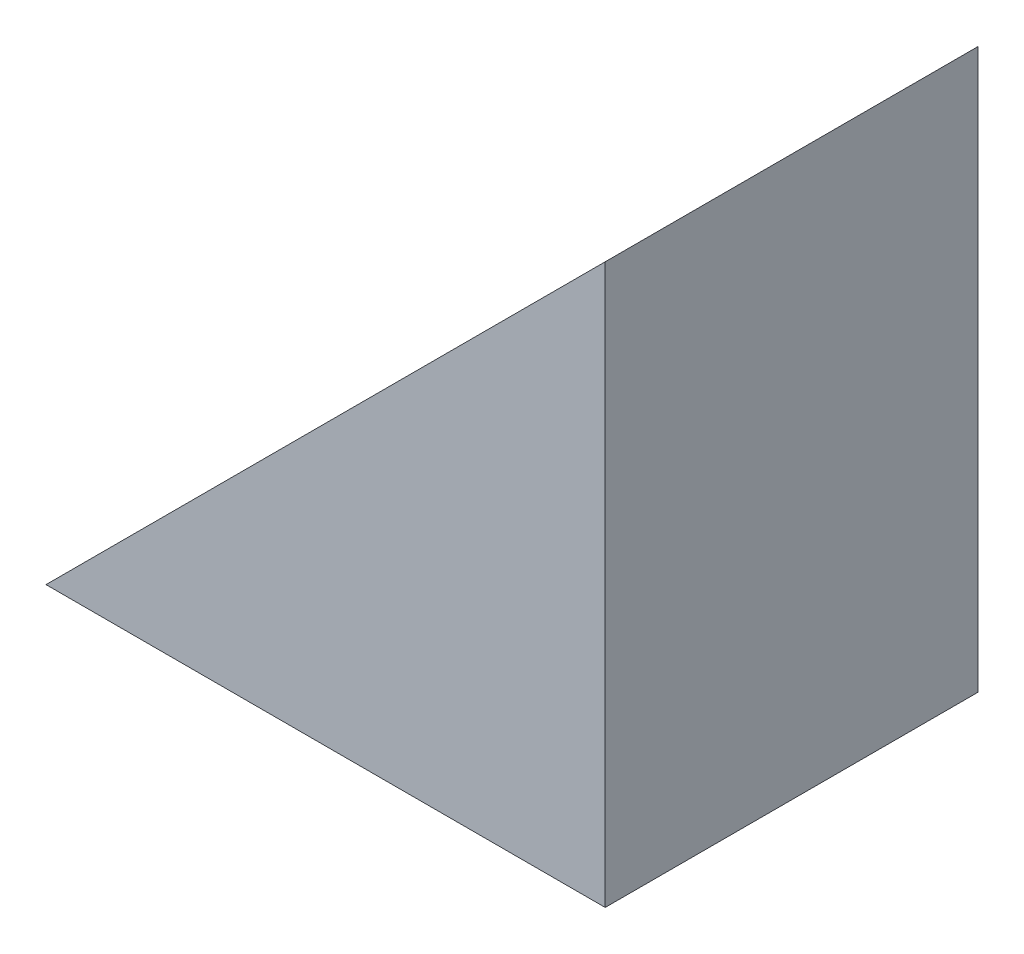
ISO-10303-21;
HEADER;
FILE_DESCRIPTION(('STEP AP214'),'2;1');
FILE_NAME('part.step','',(''),(''),'','','');
FILE_SCHEMA(('AUTOMOTIVE_DESIGN { 1 0 10303 214 1 1 1 1 }'));
ENDSEC;
DATA;
#1=APPLICATION_CONTEXT('core data for automotive mechanical design processes');
#2=APPLICATION_PROTOCOL_DEFINITION('international standard','automotive_design',2000,#1);
#3=PRODUCT_CONTEXT('',#1,'mechanical');
#4=PRODUCT('Part','Part','',(#3));
#5=PRODUCT_RELATED_PRODUCT_CATEGORY('part','',(#4));
#6=PRODUCT_DEFINITION_FORMATION('','',#4);
#7=PRODUCT_DEFINITION_CONTEXT('part definition',#1,'design');
#8=PRODUCT_DEFINITION('design','',#6,#7);
#9=PRODUCT_DEFINITION_SHAPE('','',#8);
#10=(LENGTH_UNIT() NAMED_UNIT(*) SI_UNIT(.MILLI.,.METRE.));
#11=(NAMED_UNIT(*) PLANE_ANGLE_UNIT() SI_UNIT($,.RADIAN.));
#12=(NAMED_UNIT(*) SI_UNIT($,.STERADIAN.) SOLID_ANGLE_UNIT());
#13=UNCERTAINTY_MEASURE_WITH_UNIT(LENGTH_MEASURE(1.E-05),#10,'distance_accuracy_value','');
#14=(GEOMETRIC_REPRESENTATION_CONTEXT(3) GLOBAL_UNCERTAINTY_ASSIGNED_CONTEXT((#13)) GLOBAL_UNIT_ASSIGNED_CONTEXT((#10,
#11,#12)) REPRESENTATION_CONTEXT('',''));
#15=CARTESIAN_POINT('',(0.,0.,0.));
#16=DIRECTION('',(0.,0.,1.));
#17=DIRECTION('',(1.,0.,0.));
#18=AXIS2_PLACEMENT_3D('',#15,#16,#17);
#19=CARTESIAN_POINT('',(0.,76.2,-50.8));
#20=DIRECTION('',(1.,0.,0.));
#21=DIRECTION('',(0.,0.,-1.));
#22=AXIS2_PLACEMENT_3D('',#19,#20,#21);
#23=PLANE('',#22);
#24=DIRECTION('',(0.,1.,0.));
#25=VECTOR('',#24,1.);
#26=CARTESIAN_POINT('',(0.,76.2,0.));
#27=LINE('',#26,#25);
#28=CARTESIAN_POINT('',(0.,0.,0.));
#29=VERTEX_POINT('',#28);
#30=CARTESIAN_POINT('',(0.,76.2,0.));
#31=VERTEX_POINT('',#30);
#32=EDGE_CURVE('E86',#29,#31,#27,.T.);
#33=ORIENTED_EDGE('',*,*,#32,.F.);
#34=DIRECTION('',(0.,0.,1.));
#35=VECTOR('',#34,1.);
#36=CARTESIAN_POINT('',(0.,0.,-50.8));
#37=LINE('',#36,#35);
#38=CARTESIAN_POINT('',(0.,0.,-50.8));
#39=VERTEX_POINT('',#38);
#40=EDGE_CURVE('E11',#39,#29,#37,.T.);
#41=ORIENTED_EDGE('',*,*,#40,.F.);
#42=DIRECTION('',(0.,1.,0.));
#43=VECTOR('',#42,1.);
#44=CARTESIAN_POINT('',(0.,76.2,-50.8));
#45=LINE('',#44,#43);
#46=CARTESIAN_POINT('',(0.,76.2,-50.8));
#47=VERTEX_POINT('',#46);
#48=EDGE_CURVE('E78',#39,#47,#45,.T.);
#49=ORIENTED_EDGE('',*,*,#48,.T.);
#50=DIRECTION('',(0.,0.,1.));
#51=VECTOR('',#50,1.);
#52=CARTESIAN_POINT('',(0.,76.2,-50.8));
#53=LINE('',#52,#51);
#54=EDGE_CURVE('E37',#47,#31,#53,.T.);
#55=ORIENTED_EDGE('',*,*,#54,.T.);
#56=EDGE_LOOP('',(#33,#41,#49,#55));
#57=FACE_BOUND('',#56,.T.);
#58=ADVANCED_FACE('F34',(#57),#23,.T.);
#59=CARTESIAN_POINT('',(0.,0.,-50.8));
#60=DIRECTION('',(0.,-1.,0.));
#61=DIRECTION('',(1.,0.,0.));
#62=AXIS2_PLACEMENT_3D('',#59,#60,#61);
#63=PLANE('',#62);
#64=DIRECTION('',(1.,0.,0.));
#65=VECTOR('',#64,1.);
#66=CARTESIAN_POINT('',(0.,0.,0.));
#67=LINE('',#66,#65);
#68=CARTESIAN_POINT('',(-76.2000000000001,0.,0.));
#69=VERTEX_POINT('',#68);
#70=EDGE_CURVE('E80',#69,#29,#67,.T.);
#71=ORIENTED_EDGE('',*,*,#70,.F.);
#72=DIRECTION('',(0.,0.,1.));
#73=VECTOR('',#72,1.);
#74=CARTESIAN_POINT('',(-76.2000000000001,0.,-50.8));
#75=LINE('',#74,#73);
#76=CARTESIAN_POINT('',(-76.2000000000001,0.,-50.8));
#77=VERTEX_POINT('',#76);
#78=EDGE_CURVE('E43',#77,#69,#75,.T.);
#79=ORIENTED_EDGE('',*,*,#78,.F.);
#80=DIRECTION('',(1.,0.,0.));
#81=VECTOR('',#80,1.);
#82=CARTESIAN_POINT('',(0.,0.,-50.8));
#83=LINE('',#82,#81);
#84=EDGE_CURVE('E75',#77,#39,#83,.T.);
#85=ORIENTED_EDGE('',*,*,#84,.T.);
#86=ORIENTED_EDGE('',*,*,#40,.T.);
#87=EDGE_LOOP('',(#71,#79,#85,#86));
#88=FACE_BOUND('',#87,.T.);
#89=ADVANCED_FACE('F90',(#88),#63,.T.);
#90=CARTESIAN_POINT('',(-76.2000000000001,0.,-50.8));
#91=DIRECTION('',(-0.707106781186548,0.707106781186547,0.));
#92=DIRECTION('',(-0.707106781186547,-0.707106781186548,0.));
#93=AXIS2_PLACEMENT_3D('',#90,#91,#92);
#94=PLANE('',#93);
#95=DIRECTION('',(-0.707106781186547,-0.707106781186548,0.));
#96=VECTOR('',#95,1.);
#97=CARTESIAN_POINT('',(-76.2000000000001,0.,0.));
#98=LINE('',#97,#96);
#99=EDGE_CURVE('E73',#31,#69,#98,.T.);
#100=ORIENTED_EDGE('',*,*,#99,.F.);
#101=ORIENTED_EDGE('',*,*,#54,.F.);
#102=DIRECTION('',(-0.707106781186547,-0.707106781186548,0.));
#103=VECTOR('',#102,1.);
#104=CARTESIAN_POINT('',(-76.2000000000001,0.,-50.8));
#105=LINE('',#104,#103);
#106=EDGE_CURVE('E71',#47,#77,#105,.T.);
#107=ORIENTED_EDGE('',*,*,#106,.T.);
#108=ORIENTED_EDGE('',*,*,#78,.T.);
#109=EDGE_LOOP('',(#100,#101,#107,#108));
#110=FACE_BOUND('',#109,.T.);
#111=ADVANCED_FACE('F70',(#110),#94,.T.);
#112=CARTESIAN_POINT('',(0.,0.,-50.8));
#113=DIRECTION('',(0.,0.,-1.));
#114=DIRECTION('',(-1.,0.,0.));
#115=AXIS2_PLACEMENT_3D('',#112,#113,#114);
#116=PLANE('',#115);
#117=ORIENTED_EDGE('',*,*,#48,.F.);
#118=ORIENTED_EDGE('',*,*,#84,.F.);
#119=ORIENTED_EDGE('',*,*,#106,.F.);
#120=EDGE_LOOP('',(#117,#118,#119));
#121=FACE_BOUND('',#120,.T.);
#122=ADVANCED_FACE('F77',(#121),#116,.T.);
#123=CARTESIAN_POINT('',(0.,0.,0.));
#124=DIRECTION('',(0.,0.,-1.));
#125=DIRECTION('',(-1.,0.,0.));
#126=AXIS2_PLACEMENT_3D('',#123,#124,#125);
#127=PLANE('',#126);
#128=ORIENTED_EDGE('',*,*,#32,.T.);
#129=ORIENTED_EDGE('',*,*,#99,.T.);
#130=ORIENTED_EDGE('',*,*,#70,.T.);
#131=EDGE_LOOP('',(#128,#129,#130));
#132=FACE_BOUND('',#131,.T.);
#133=ADVANCED_FACE('F89',(#132),#127,.F.);
#134=CLOSED_SHELL('',(#58,#89,#111,#122,#133));
#135=MANIFOLD_SOLID_BREP('B2',#134);
#136=ADVANCED_BREP_SHAPE_REPRESENTATION('',(#18,#135),#14);
#137=SHAPE_DEFINITION_REPRESENTATION(#9,#136);
ENDSEC;
END-ISO-10303-21;
